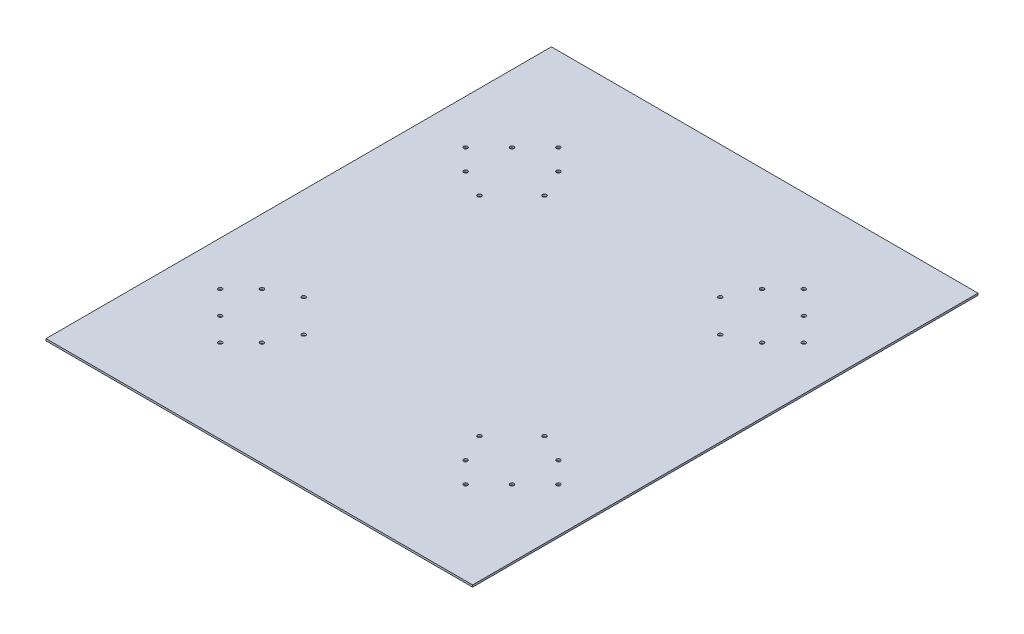
ISO-10303-21;
HEADER;
FILE_DESCRIPTION(('STEP AP214'),'2;1');
FILE_NAME('part.step','',(''),(''),'','','');
FILE_SCHEMA(('AUTOMOTIVE_DESIGN { 1 0 10303 214 1 1 1 1 }'));
ENDSEC;
DATA;
#1=APPLICATION_CONTEXT('core data for automotive mechanical design processes');
#2=APPLICATION_PROTOCOL_DEFINITION('international standard','automotive_design',2000,#1);
#3=PRODUCT_CONTEXT('',#1,'mechanical');
#4=PRODUCT('Part','Part','',(#3));
#5=PRODUCT_RELATED_PRODUCT_CATEGORY('part','',(#4));
#6=PRODUCT_DEFINITION_FORMATION('','',#4);
#7=PRODUCT_DEFINITION_CONTEXT('part definition',#1,'design');
#8=PRODUCT_DEFINITION('design','',#6,#7);
#9=PRODUCT_DEFINITION_SHAPE('','',#8);
#10=(LENGTH_UNIT() NAMED_UNIT(*) SI_UNIT(.MILLI.,.METRE.));
#11=(NAMED_UNIT(*) PLANE_ANGLE_UNIT() SI_UNIT($,.RADIAN.));
#12=(NAMED_UNIT(*) SI_UNIT($,.STERADIAN.) SOLID_ANGLE_UNIT());
#13=UNCERTAINTY_MEASURE_WITH_UNIT(LENGTH_MEASURE(1.E-05),#10,'distance_accuracy_value','');
#14=(GEOMETRIC_REPRESENTATION_CONTEXT(3) GLOBAL_UNCERTAINTY_ASSIGNED_CONTEXT((#13)) GLOBAL_UNIT_ASSIGNED_CONTEXT((#10,
#11,#12)) REPRESENTATION_CONTEXT('',''));
#15=CARTESIAN_POINT('',(0.,0.,0.));
#16=DIRECTION('',(0.,0.,1.));
#17=DIRECTION('',(1.,0.,0.));
#18=AXIS2_PLACEMENT_3D('',#15,#16,#17);
#19=CARTESIAN_POINT('',(3.7195855089245E-13,1313.54841330862,1889.22722695485));
#20=DIRECTION('',(0.,0.,-1.));
#21=DIRECTION('',(0.,1.,0.));
#22=AXIS2_PLACEMENT_3D('',#19,#20,#21);
#23=PLANE('',#22);
#24=DIRECTION('',(1.,0.,0.));
#25=VECTOR('',#24,1.);
#26=CARTESIAN_POINT('',(3.71209150350828E-13,1310.54841330862,1889.22722695485));
#27=LINE('',#26,#25);
#28=CARTESIAN_POINT('',(740.777273447474,1310.54841330862,1889.22722695485));
#29=VERTEX_POINT('',#28);
#30=CARTESIAN_POINT('',(1390.77727344747,1310.54841330862,1889.22722695485));
#31=VERTEX_POINT('',#30);
#32=EDGE_CURVE('E186',#29,#31,#27,.T.);
#33=ORIENTED_EDGE('',*,*,#32,.T.);
#34=DIRECTION('',(0.,-1.,0.));
#35=VECTOR('',#34,1.);
#36=CARTESIAN_POINT('',(1390.77727344747,1313.54841330862,1889.22722695485));
#37=LINE('',#36,#35);
#38=CARTESIAN_POINT('',(1390.77727344747,1313.54841330862,1889.22722695485));
#39=VERTEX_POINT('',#38);
#40=EDGE_CURVE('E11',#39,#31,#37,.T.);
#41=ORIENTED_EDGE('',*,*,#40,.F.);
#42=DIRECTION('',(1.,0.,0.));
#43=VECTOR('',#42,1.);
#44=CARTESIAN_POINT('',(3.7195855089245E-13,1313.54841330862,1889.22722695485));
#45=LINE('',#44,#43);
#46=CARTESIAN_POINT('',(740.777273447474,1313.54841330862,1889.22722695485));
#47=VERTEX_POINT('',#46);
#48=EDGE_CURVE('E88',#47,#39,#45,.T.);
#49=ORIENTED_EDGE('',*,*,#48,.F.);
#50=DIRECTION('',(0.,-1.,0.));
#51=VECTOR('',#50,1.);
#52=CARTESIAN_POINT('',(740.777273447474,1313.54841330862,1889.22722695485));
#53=LINE('',#52,#51);
#54=EDGE_CURVE('E54',#47,#29,#53,.T.);
#55=ORIENTED_EDGE('',*,*,#54,.T.);
#56=EDGE_LOOP('',(#33,#41,#49,#55));
#57=FACE_BOUND('',#56,.T.);
#58=ADVANCED_FACE('F37',(#57),#23,.F.);
#59=CARTESIAN_POINT('',(1390.77727344747,1313.54841330862,0.));
#60=DIRECTION('',(-1.,0.,0.));
#61=DIRECTION('',(0.,-1.,0.));
#62=AXIS2_PLACEMENT_3D('',#59,#60,#61);
#63=PLANE('',#62);
#64=DIRECTION('',(0.,0.,-1.));
#65=VECTOR('',#64,1.);
#66=CARTESIAN_POINT('',(1390.77727344747,1310.54841330862,0.));
#67=LINE('',#66,#65);
#68=CARTESIAN_POINT('',(1390.77727344747,1310.54841330862,1119.22722695485));
#69=VERTEX_POINT('',#68);
#70=EDGE_CURVE('E93',#31,#69,#67,.T.);
#71=ORIENTED_EDGE('',*,*,#70,.T.);
#72=DIRECTION('',(0.,-1.,0.));
#73=VECTOR('',#72,1.);
#74=CARTESIAN_POINT('',(1390.77727344747,1313.54841330862,1119.22722695485));
#75=LINE('',#74,#73);
#76=CARTESIAN_POINT('',(1390.77727344747,1313.54841330862,1119.22722695485));
#77=VERTEX_POINT('',#76);
#78=EDGE_CURVE('E46',#77,#69,#75,.T.);
#79=ORIENTED_EDGE('',*,*,#78,.F.);
#80=DIRECTION('',(0.,0.,-1.));
#81=VECTOR('',#80,1.);
#82=CARTESIAN_POINT('',(1390.77727344747,1313.54841330862,0.));
#83=LINE('',#82,#81);
#84=EDGE_CURVE('E79',#39,#77,#83,.T.);
#85=ORIENTED_EDGE('',*,*,#84,.F.);
#86=ORIENTED_EDGE('',*,*,#40,.T.);
#87=EDGE_LOOP('',(#71,#79,#85,#86));
#88=FACE_BOUND('',#87,.T.);
#89=ADVANCED_FACE('F92',(#88),#63,.F.);
#90=CARTESIAN_POINT('',(3.7195855089245E-13,1313.54841330862,1119.22722695485));
#91=DIRECTION('',(0.,0.,-1.));
#92=DIRECTION('',(0.,1.,0.));
#93=AXIS2_PLACEMENT_3D('',#90,#91,#92);
#94=PLANE('',#93);
#95=DIRECTION('',(1.,0.,0.));
#96=VECTOR('',#95,1.);
#97=CARTESIAN_POINT('',(3.71209150350828E-13,1310.54841330862,1119.22722695485));
#98=LINE('',#97,#96);
#99=CARTESIAN_POINT('',(740.777273447474,1310.54841330862,1119.22722695485));
#100=VERTEX_POINT('',#99);
#101=EDGE_CURVE('E189',#100,#69,#98,.T.);
#102=ORIENTED_EDGE('',*,*,#101,.F.);
#103=DIRECTION('',(0.,-1.,0.));
#104=VECTOR('',#103,1.);
#105=CARTESIAN_POINT('',(740.777273447474,1313.54841330862,1119.22722695485));
#106=LINE('',#105,#104);
#107=CARTESIAN_POINT('',(740.777273447474,1313.54841330862,1119.22722695485));
#108=VERTEX_POINT('',#107);
#109=EDGE_CURVE('E68',#108,#100,#106,.T.);
#110=ORIENTED_EDGE('',*,*,#109,.F.);
#111=DIRECTION('',(1.,0.,0.));
#112=VECTOR('',#111,1.);
#113=CARTESIAN_POINT('',(3.7195855089245E-13,1313.54841330862,1119.22722695485));
#114=LINE('',#113,#112);
#115=EDGE_CURVE('E87',#108,#77,#114,.T.);
#116=ORIENTED_EDGE('',*,*,#115,.T.);
#117=ORIENTED_EDGE('',*,*,#78,.T.);
#118=EDGE_LOOP('',(#102,#110,#116,#117));
#119=FACE_BOUND('',#118,.T.);
#120=ADVANCED_FACE('F96',(#119),#94,.T.);
#121=CARTESIAN_POINT('',(931.851249090738,1313.54841330862,1320.80372791505));
#122=DIRECTION('',(0.,-1.,0.));
#123=DIRECTION('',(1.,0.,0.));
#124=AXIS2_PLACEMENT_3D('',#121,#122,#123);
#125=CYLINDRICAL_SURFACE('',#124,3.00000000000015);
#126=CARTESIAN_POINT('',(931.851249090738,1313.54841330862,1320.80372791505));
#127=DIRECTION('',(0.,1.,0.));
#128=DIRECTION('',(-1.,0.,0.));
#129=AXIS2_PLACEMENT_3D('',#126,#127,#128);
#130=CIRCLE('',#129,3.00000000000015);
#131=CARTESIAN_POINT('',(928.851249090738,1313.54841330862,1320.80372791505));
#132=VERTEX_POINT('',#131);
#133=EDGE_CURVE('E174',#132,#132,#130,.T.);
#134=ORIENTED_EDGE('',*,*,#133,.T.);
#135=EDGE_LOOP('',(#134));
#136=FACE_BOUND('',#135,.T.);
#137=CARTESIAN_POINT('',(931.851249090738,1310.54841330862,1320.80372791505));
#138=DIRECTION('',(0.,1.,0.));
#139=DIRECTION('',(-1.,0.,0.));
#140=AXIS2_PLACEMENT_3D('',#137,#138,#139);
#141=CIRCLE('',#140,3.00000000000015);
#142=CARTESIAN_POINT('',(928.851249090738,1310.54841330862,1320.80372791505));
#143=VERTEX_POINT('',#142);
#144=EDGE_CURVE('E266',#143,#143,#141,.T.);
#145=ORIENTED_EDGE('',*,*,#144,.F.);
#146=EDGE_LOOP('',(#145));
#147=FACE_BOUND('',#146,.T.);
#148=ADVANCED_FACE('F324',(#136,#147),#125,.F.);
#149=CARTESIAN_POINT('',(910.638045655138,1313.54841330862,1278.37732104386));
#150=DIRECTION('',(0.,-1.,0.));
#151=DIRECTION('',(1.,0.,0.));
#152=AXIS2_PLACEMENT_3D('',#149,#150,#151);
#153=CYLINDRICAL_SURFACE('',#152,3.00000000000015);
#154=CARTESIAN_POINT('',(910.638045655138,1313.54841330862,1278.37732104386));
#155=DIRECTION('',(0.,1.,0.));
#156=DIRECTION('',(-1.,0.,0.));
#157=AXIS2_PLACEMENT_3D('',#154,#155,#156);
#158=CIRCLE('',#157,3.00000000000015);
#159=CARTESIAN_POINT('',(907.638045655138,1313.54841330862,1278.37732104386));
#160=VERTEX_POINT('',#159);
#161=EDGE_CURVE('E171',#160,#160,#158,.T.);
#162=ORIENTED_EDGE('',*,*,#161,.T.);
#163=EDGE_LOOP('',(#162));
#164=FACE_BOUND('',#163,.T.);
#165=CARTESIAN_POINT('',(910.638045655138,1310.54841330862,1278.37732104386));
#166=DIRECTION('',(0.,1.,0.));
#167=DIRECTION('',(-1.,0.,0.));
#168=AXIS2_PLACEMENT_3D('',#165,#166,#167);
#169=CIRCLE('',#168,3.00000000000015);
#170=CARTESIAN_POINT('',(907.638045655138,1310.54841330862,1278.37732104386));
#171=VERTEX_POINT('',#170);
#172=EDGE_CURVE('E263',#171,#171,#169,.T.);
#173=ORIENTED_EDGE('',*,*,#172,.F.);
#174=EDGE_LOOP('',(#173));
#175=FACE_BOUND('',#174,.T.);
#176=ADVANCED_FACE('F328',(#164,#175),#153,.F.);
#177=CARTESIAN_POINT('',(878.818240501748,1313.54841330862,1246.55751589047));
#178=DIRECTION('',(0.,-1.,0.));
#179=DIRECTION('',(1.,0.,0.));
#180=AXIS2_PLACEMENT_3D('',#177,#178,#179);
#181=CYLINDRICAL_SURFACE('',#180,3.00000000000015);
#182=CARTESIAN_POINT('',(878.818240501748,1313.54841330862,1246.55751589047));
#183=DIRECTION('',(0.,1.,0.));
#184=DIRECTION('',(-1.,0.,0.));
#185=AXIS2_PLACEMENT_3D('',#182,#183,#184);
#186=CIRCLE('',#185,3.00000000000015);
#187=CARTESIAN_POINT('',(875.818240501748,1313.54841330862,1246.55751589047));
#188=VERTEX_POINT('',#187);
#189=EDGE_CURVE('E168',#188,#188,#186,.T.);
#190=ORIENTED_EDGE('',*,*,#189,.T.);
#191=EDGE_LOOP('',(#190));
#192=FACE_BOUND('',#191,.T.);
#193=CARTESIAN_POINT('',(878.818240501748,1310.54841330862,1246.55751589047));
#194=DIRECTION('',(0.,1.,0.));
#195=DIRECTION('',(-1.,0.,0.));
#196=AXIS2_PLACEMENT_3D('',#193,#194,#195);
#197=CIRCLE('',#196,3.00000000000015);
#198=CARTESIAN_POINT('',(875.818240501748,1310.54841330862,1246.55751589047));
#199=VERTEX_POINT('',#198);
#200=EDGE_CURVE('E260',#199,#199,#197,.T.);
#201=ORIENTED_EDGE('',*,*,#200,.F.);
#202=EDGE_LOOP('',(#201));
#203=FACE_BOUND('',#202,.T.);
#204=ADVANCED_FACE('F334',(#192,#203),#181,.F.);
#205=CARTESIAN_POINT('',(843.462901442418,1313.54841330862,1281.9128549498));
#206=DIRECTION('',(0.,-1.,0.));
#207=DIRECTION('',(1.,0.,0.));
#208=AXIS2_PLACEMENT_3D('',#205,#206,#207);
#209=CYLINDRICAL_SURFACE('',#208,3.00000000000015);
#210=CARTESIAN_POINT('',(843.462901442418,1313.54841330862,1281.9128549498));
#211=DIRECTION('',(0.,1.,0.));
#212=DIRECTION('',(-1.,0.,0.));
#213=AXIS2_PLACEMENT_3D('',#210,#211,#212);
#214=CIRCLE('',#213,3.00000000000015);
#215=CARTESIAN_POINT('',(840.462901442418,1313.54841330862,1281.9128549498));
#216=VERTEX_POINT('',#215);
#217=EDGE_CURVE('E165',#216,#216,#214,.T.);
#218=ORIENTED_EDGE('',*,*,#217,.T.);
#219=EDGE_LOOP('',(#218));
#220=FACE_BOUND('',#219,.T.);
#221=CARTESIAN_POINT('',(843.462901442418,1310.54841330862,1281.9128549498));
#222=DIRECTION('',(0.,1.,0.));
#223=DIRECTION('',(-1.,0.,0.));
#224=AXIS2_PLACEMENT_3D('',#221,#222,#223);
#225=CIRCLE('',#224,3.00000000000015);
#226=CARTESIAN_POINT('',(840.462901442418,1310.54841330862,1281.9128549498));
#227=VERTEX_POINT('',#226);
#228=EDGE_CURVE('E257',#227,#227,#225,.T.);
#229=ORIENTED_EDGE('',*,*,#228,.F.);
#230=EDGE_LOOP('',(#229));
#231=FACE_BOUND('',#230,.T.);
#232=ADVANCED_FACE('F341',(#220,#231),#209,.F.);
#233=CARTESIAN_POINT('',(808.107562383088,1313.54841330862,1317.26819400912));
#234=DIRECTION('',(0.,-1.,0.));
#235=DIRECTION('',(1.,0.,0.));
#236=AXIS2_PLACEMENT_3D('',#233,#234,#235);
#237=CYLINDRICAL_SURFACE('',#236,3.00000000000015);
#238=CARTESIAN_POINT('',(808.107562383088,1313.54841330862,1317.26819400912));
#239=DIRECTION('',(0.,1.,0.));
#240=DIRECTION('',(-1.,0.,0.));
#241=AXIS2_PLACEMENT_3D('',#238,#239,#240);
#242=CIRCLE('',#241,3.00000000000015);
#243=CARTESIAN_POINT('',(805.107562383088,1313.54841330862,1317.26819400912));
#244=VERTEX_POINT('',#243);
#245=EDGE_CURVE('E162',#244,#244,#242,.T.);
#246=ORIENTED_EDGE('',*,*,#245,.T.);
#247=EDGE_LOOP('',(#246));
#248=FACE_BOUND('',#247,.T.);
#249=CARTESIAN_POINT('',(808.107562383088,1310.54841330862,1317.26819400912));
#250=DIRECTION('',(0.,1.,0.));
#251=DIRECTION('',(-1.,0.,0.));
#252=AXIS2_PLACEMENT_3D('',#249,#250,#251);
#253=CIRCLE('',#252,3.00000000000015);
#254=CARTESIAN_POINT('',(805.107562383088,1310.54841330862,1317.26819400912));
#255=VERTEX_POINT('',#254);
#256=EDGE_CURVE('E254',#255,#255,#253,.T.);
#257=ORIENTED_EDGE('',*,*,#256,.F.);
#258=EDGE_LOOP('',(#257));
#259=FACE_BOUND('',#258,.T.);
#260=ADVANCED_FACE('F345',(#248,#259),#237,.F.);
#261=CARTESIAN_POINT('',(839.927367536488,1313.54841330862,1349.08799916252));
#262=DIRECTION('',(0.,-1.,0.));
#263=DIRECTION('',(1.,0.,0.));
#264=AXIS2_PLACEMENT_3D('',#261,#262,#263);
#265=CYLINDRICAL_SURFACE('',#264,3.00000000000015);
#266=CARTESIAN_POINT('',(839.927367536488,1313.54841330862,1349.08799916252));
#267=DIRECTION('',(0.,1.,0.));
#268=DIRECTION('',(-1.,0.,0.));
#269=AXIS2_PLACEMENT_3D('',#266,#267,#268);
#270=CIRCLE('',#269,3.00000000000015);
#271=CARTESIAN_POINT('',(836.927367536488,1313.54841330862,1349.08799916252));
#272=VERTEX_POINT('',#271);
#273=EDGE_CURVE('E159',#272,#272,#270,.T.);
#274=ORIENTED_EDGE('',*,*,#273,.T.);
#275=EDGE_LOOP('',(#274));
#276=FACE_BOUND('',#275,.T.);
#277=CARTESIAN_POINT('',(839.927367536488,1310.54841330862,1349.08799916252));
#278=DIRECTION('',(0.,1.,0.));
#279=DIRECTION('',(-1.,0.,0.));
#280=AXIS2_PLACEMENT_3D('',#277,#278,#279);
#281=CIRCLE('',#280,3.00000000000015);
#282=CARTESIAN_POINT('',(836.927367536488,1310.54841330862,1349.08799916252));
#283=VERTEX_POINT('',#282);
#284=EDGE_CURVE('E251',#283,#283,#281,.T.);
#285=ORIENTED_EDGE('',*,*,#284,.F.);
#286=EDGE_LOOP('',(#285));
#287=FACE_BOUND('',#286,.T.);
#288=ADVANCED_FACE('F349',(#276,#287),#265,.F.);
#289=CARTESIAN_POINT('',(1249.20077248726,1313.54841330862,1638.15325131158));
#290=DIRECTION('',(0.,-1.,0.));
#291=DIRECTION('',(1.,0.,0.));
#292=AXIS2_PLACEMENT_3D('',#289,#290,#291);
#293=CYLINDRICAL_SURFACE('',#292,3.00000000000015);
#294=CARTESIAN_POINT('',(1249.20077248726,1313.54841330862,1638.15325131158));
#295=DIRECTION('',(0.,1.,0.));
#296=DIRECTION('',(-1.,0.,0.));
#297=AXIS2_PLACEMENT_3D('',#294,#295,#296);
#298=CIRCLE('',#297,3.00000000000015);
#299=CARTESIAN_POINT('',(1246.20077248726,1313.54841330862,1638.15325131158));
#300=VERTEX_POINT('',#299);
#301=EDGE_CURVE('E156',#300,#300,#298,.T.);
#302=ORIENTED_EDGE('',*,*,#301,.T.);
#303=EDGE_LOOP('',(#302));
#304=FACE_BOUND('',#303,.T.);
#305=CARTESIAN_POINT('',(1249.20077248726,1310.54841330862,1638.15325131158));
#306=DIRECTION('',(0.,1.,0.));
#307=DIRECTION('',(-1.,0.,0.));
#308=AXIS2_PLACEMENT_3D('',#305,#306,#307);
#309=CIRCLE('',#308,3.00000000000015);
#310=CARTESIAN_POINT('',(1246.20077248726,1310.54841330862,1638.15325131158));
#311=VERTEX_POINT('',#310);
#312=EDGE_CURVE('E248',#311,#311,#309,.T.);
#313=ORIENTED_EDGE('',*,*,#312,.F.);
#314=EDGE_LOOP('',(#313));
#315=FACE_BOUND('',#314,.T.);
#316=ADVANCED_FACE('F353',(#304,#315),#293,.F.);
#317=CARTESIAN_POINT('',(1199.7032978042,1313.54841330862,1687.65072599464));
#318=DIRECTION('',(0.,-1.,0.));
#319=DIRECTION('',(1.,0.,0.));
#320=AXIS2_PLACEMENT_3D('',#317,#318,#319);
#321=CYLINDRICAL_SURFACE('',#320,3.00000000000015);
#322=CARTESIAN_POINT('',(1199.7032978042,1313.54841330862,1687.65072599464));
#323=DIRECTION('',(0.,1.,0.));
#324=DIRECTION('',(-1.,0.,0.));
#325=AXIS2_PLACEMENT_3D('',#322,#323,#324);
#326=CIRCLE('',#325,3.00000000000015);
#327=CARTESIAN_POINT('',(1196.7032978042,1313.54841330862,1687.65072599464));
#328=VERTEX_POINT('',#327);
#329=EDGE_CURVE('E153',#328,#328,#326,.T.);
#330=ORIENTED_EDGE('',*,*,#329,.T.);
#331=EDGE_LOOP('',(#330));
#332=FACE_BOUND('',#331,.T.);
#333=CARTESIAN_POINT('',(1199.7032978042,1310.54841330862,1687.65072599464));
#334=DIRECTION('',(0.,1.,0.));
#335=DIRECTION('',(-1.,0.,0.));
#336=AXIS2_PLACEMENT_3D('',#333,#334,#335);
#337=CIRCLE('',#336,3.00000000000015);
#338=CARTESIAN_POINT('',(1196.7032978042,1310.54841330862,1687.65072599464));
#339=VERTEX_POINT('',#338);
#340=EDGE_CURVE('E245',#339,#339,#337,.T.);
#341=ORIENTED_EDGE('',*,*,#340,.F.);
#342=EDGE_LOOP('',(#341));
#343=FACE_BOUND('',#342,.T.);
#344=ADVANCED_FACE('F357',(#332,#343),#321,.F.);
#345=CARTESIAN_POINT('',(1220.9165012398,1313.54841330862,1730.07713286583));
#346=DIRECTION('',(0.,-1.,0.));
#347=DIRECTION('',(1.,0.,0.));
#348=AXIS2_PLACEMENT_3D('',#345,#346,#347);
#349=CYLINDRICAL_SURFACE('',#348,3.00000000000015);
#350=CARTESIAN_POINT('',(1220.9165012398,1313.54841330862,1730.07713286583));
#351=DIRECTION('',(0.,1.,0.));
#352=DIRECTION('',(-1.,0.,0.));
#353=AXIS2_PLACEMENT_3D('',#350,#351,#352);
#354=CIRCLE('',#353,3.00000000000015);
#355=CARTESIAN_POINT('',(1217.9165012398,1313.54841330862,1730.07713286583));
#356=VERTEX_POINT('',#355);
#357=EDGE_CURVE('E150',#356,#356,#354,.T.);
#358=ORIENTED_EDGE('',*,*,#357,.T.);
#359=EDGE_LOOP('',(#358));
#360=FACE_BOUND('',#359,.T.);
#361=CARTESIAN_POINT('',(1220.9165012398,1310.54841330862,1730.07713286583));
#362=DIRECTION('',(0.,1.,0.));
#363=DIRECTION('',(-1.,0.,0.));
#364=AXIS2_PLACEMENT_3D('',#361,#362,#363);
#365=CIRCLE('',#364,3.00000000000015);
#366=CARTESIAN_POINT('',(1217.9165012398,1310.54841330862,1730.07713286583));
#367=VERTEX_POINT('',#366);
#368=EDGE_CURVE('E242',#367,#367,#365,.T.);
#369=ORIENTED_EDGE('',*,*,#368,.F.);
#370=EDGE_LOOP('',(#369));
#371=FACE_BOUND('',#370,.T.);
#372=ADVANCED_FACE('F361',(#360,#371),#349,.F.);
#373=CARTESIAN_POINT('',(1252.73630639319,1313.54841330862,1761.89693801923));
#374=DIRECTION('',(0.,-1.,0.));
#375=DIRECTION('',(1.,0.,0.));
#376=AXIS2_PLACEMENT_3D('',#373,#374,#375);
#377=CYLINDRICAL_SURFACE('',#376,3.00000000000015);
#378=CARTESIAN_POINT('',(1252.73630639319,1313.54841330862,1761.89693801923));
#379=DIRECTION('',(0.,1.,0.));
#380=DIRECTION('',(-1.,0.,0.));
#381=AXIS2_PLACEMENT_3D('',#378,#379,#380);
#382=CIRCLE('',#381,3.00000000000015);
#383=CARTESIAN_POINT('',(1249.73630639319,1313.54841330862,1761.89693801923));
#384=VERTEX_POINT('',#383);
#385=EDGE_CURVE('E147',#384,#384,#382,.T.);
#386=ORIENTED_EDGE('',*,*,#385,.T.);
#387=EDGE_LOOP('',(#386));
#388=FACE_BOUND('',#387,.T.);
#389=CARTESIAN_POINT('',(1252.73630639319,1310.54841330862,1761.89693801923));
#390=DIRECTION('',(0.,1.,0.));
#391=DIRECTION('',(-1.,0.,0.));
#392=AXIS2_PLACEMENT_3D('',#389,#390,#391);
#393=CIRCLE('',#392,3.00000000000015);
#394=CARTESIAN_POINT('',(1249.73630639319,1310.54841330862,1761.89693801923));
#395=VERTEX_POINT('',#394);
#396=EDGE_CURVE('E239',#395,#395,#393,.T.);
#397=ORIENTED_EDGE('',*,*,#396,.F.);
#398=EDGE_LOOP('',(#397));
#399=FACE_BOUND('',#398,.T.);
#400=ADVANCED_FACE('F365',(#388,#399),#377,.F.);
#401=CARTESIAN_POINT('',(1288.09164545252,1313.54841330862,1726.5415989599));
#402=DIRECTION('',(0.,-1.,0.));
#403=DIRECTION('',(1.,0.,0.));
#404=AXIS2_PLACEMENT_3D('',#401,#402,#403);
#405=CYLINDRICAL_SURFACE('',#404,3.00000000000015);
#406=CARTESIAN_POINT('',(1288.09164545252,1313.54841330862,1726.5415989599));
#407=DIRECTION('',(0.,1.,0.));
#408=DIRECTION('',(-1.,0.,0.));
#409=AXIS2_PLACEMENT_3D('',#406,#407,#408);
#410=CIRCLE('',#409,3.00000000000015);
#411=CARTESIAN_POINT('',(1285.09164545252,1313.54841330862,1726.5415989599));
#412=VERTEX_POINT('',#411);
#413=EDGE_CURVE('E144',#412,#412,#410,.T.);
#414=ORIENTED_EDGE('',*,*,#413,.T.);
#415=EDGE_LOOP('',(#414));
#416=FACE_BOUND('',#415,.T.);
#417=CARTESIAN_POINT('',(1288.09164545252,1310.54841330862,1726.5415989599));
#418=DIRECTION('',(0.,1.,0.));
#419=DIRECTION('',(-1.,0.,0.));
#420=AXIS2_PLACEMENT_3D('',#417,#418,#419);
#421=CIRCLE('',#420,3.00000000000015);
#422=CARTESIAN_POINT('',(1285.09164545252,1310.54841330862,1726.5415989599));
#423=VERTEX_POINT('',#422);
#424=EDGE_CURVE('E236',#423,#423,#421,.T.);
#425=ORIENTED_EDGE('',*,*,#424,.F.);
#426=EDGE_LOOP('',(#425));
#427=FACE_BOUND('',#426,.T.);
#428=ADVANCED_FACE('F369',(#416,#427),#405,.F.);
#429=CARTESIAN_POINT('',(1323.44698451185,1313.54841330862,1691.18625990057));
#430=DIRECTION('',(0.,-1.,0.));
#431=DIRECTION('',(1.,0.,0.));
#432=AXIS2_PLACEMENT_3D('',#429,#430,#431);
#433=CYLINDRICAL_SURFACE('',#432,3.00000000000015);
#434=CARTESIAN_POINT('',(1323.44698451185,1313.54841330862,1691.18625990057));
#435=DIRECTION('',(0.,1.,0.));
#436=DIRECTION('',(-1.,0.,0.));
#437=AXIS2_PLACEMENT_3D('',#434,#435,#436);
#438=CIRCLE('',#437,3.00000000000015);
#439=CARTESIAN_POINT('',(1320.44698451185,1313.54841330862,1691.18625990057));
#440=VERTEX_POINT('',#439);
#441=EDGE_CURVE('E141',#440,#440,#438,.T.);
#442=ORIENTED_EDGE('',*,*,#441,.T.);
#443=EDGE_LOOP('',(#442));
#444=FACE_BOUND('',#443,.T.);
#445=CARTESIAN_POINT('',(1323.44698451185,1310.54841330862,1691.18625990057));
#446=DIRECTION('',(0.,1.,0.));
#447=DIRECTION('',(-1.,0.,0.));
#448=AXIS2_PLACEMENT_3D('',#445,#446,#447);
#449=CIRCLE('',#448,3.00000000000015);
#450=CARTESIAN_POINT('',(1320.44698451185,1310.54841330862,1691.18625990057));
#451=VERTEX_POINT('',#450);
#452=EDGE_CURVE('E233',#451,#451,#449,.T.);
#453=ORIENTED_EDGE('',*,*,#452,.F.);
#454=EDGE_LOOP('',(#453));
#455=FACE_BOUND('',#454,.T.);
#456=ADVANCED_FACE('F373',(#444,#455),#433,.F.);
#457=CARTESIAN_POINT('',(1291.62717935845,1313.54841330862,1659.36645474718));
#458=DIRECTION('',(0.,-1.,0.));
#459=DIRECTION('',(1.,0.,0.));
#460=AXIS2_PLACEMENT_3D('',#457,#458,#459);
#461=CYLINDRICAL_SURFACE('',#460,3.00000000000015);
#462=CARTESIAN_POINT('',(1291.62717935845,1313.54841330862,1659.36645474718));
#463=DIRECTION('',(0.,1.,0.));
#464=DIRECTION('',(-1.,0.,0.));
#465=AXIS2_PLACEMENT_3D('',#462,#463,#464);
#466=CIRCLE('',#465,3.00000000000015);
#467=CARTESIAN_POINT('',(1288.62717935845,1313.54841330862,1659.36645474718));
#468=VERTEX_POINT('',#467);
#469=EDGE_CURVE('E138',#468,#468,#466,.T.);
#470=ORIENTED_EDGE('',*,*,#469,.T.);
#471=EDGE_LOOP('',(#470));
#472=FACE_BOUND('',#471,.T.);
#473=CARTESIAN_POINT('',(1291.62717935845,1310.54841330862,1659.36645474718));
#474=DIRECTION('',(0.,1.,0.));
#475=DIRECTION('',(-1.,0.,0.));
#476=AXIS2_PLACEMENT_3D('',#473,#474,#475);
#477=CIRCLE('',#476,3.00000000000015);
#478=CARTESIAN_POINT('',(1288.62717935845,1310.54841330862,1659.36645474718));
#479=VERTEX_POINT('',#478);
#480=EDGE_CURVE('E230',#479,#479,#477,.T.);
#481=ORIENTED_EDGE('',*,*,#480,.F.);
#482=EDGE_LOOP('',(#481));
#483=FACE_BOUND('',#482,.T.);
#484=ADVANCED_FACE('F377',(#472,#483),#461,.F.);
#485=CARTESIAN_POINT('',(839.927367536488,1313.54841330862,1659.36645474717));
#486=DIRECTION('',(0.,-1.,0.));
#487=DIRECTION('',(1.,0.,0.));
#488=AXIS2_PLACEMENT_3D('',#485,#486,#487);
#489=CYLINDRICAL_SURFACE('',#488,3.00000000000015);
#490=CARTESIAN_POINT('',(839.927367536488,1313.54841330862,1659.36645474717));
#491=DIRECTION('',(0.,1.,0.));
#492=DIRECTION('',(-1.,0.,0.));
#493=AXIS2_PLACEMENT_3D('',#490,#491,#492);
#494=CIRCLE('',#493,3.00000000000015);
#495=CARTESIAN_POINT('',(836.927367536488,1313.54841330862,1659.36645474717));
#496=VERTEX_POINT('',#495);
#497=EDGE_CURVE('E135',#496,#496,#494,.T.);
#498=ORIENTED_EDGE('',*,*,#497,.T.);
#499=EDGE_LOOP('',(#498));
#500=FACE_BOUND('',#499,.T.);
#501=CARTESIAN_POINT('',(839.927367536488,1310.54841330862,1659.36645474717));
#502=DIRECTION('',(0.,1.,0.));
#503=DIRECTION('',(-1.,0.,0.));
#504=AXIS2_PLACEMENT_3D('',#501,#502,#503);
#505=CIRCLE('',#504,3.00000000000015);
#506=CARTESIAN_POINT('',(836.927367536488,1310.54841330862,1659.36645474717));
#507=VERTEX_POINT('',#506);
#508=EDGE_CURVE('E227',#507,#507,#505,.T.);
#509=ORIENTED_EDGE('',*,*,#508,.F.);
#510=EDGE_LOOP('',(#509));
#511=FACE_BOUND('',#510,.T.);
#512=ADVANCED_FACE('F381',(#500,#511),#489,.F.);
#513=CARTESIAN_POINT('',(808.107562383088,1313.54841330862,1691.18625990057));
#514=DIRECTION('',(0.,-1.,0.));
#515=DIRECTION('',(1.,0.,0.));
#516=AXIS2_PLACEMENT_3D('',#513,#514,#515);
#517=CYLINDRICAL_SURFACE('',#516,3.00000000000015);
#518=CARTESIAN_POINT('',(808.107562383088,1313.54841330862,1691.18625990057));
#519=DIRECTION('',(0.,1.,0.));
#520=DIRECTION('',(-1.,0.,0.));
#521=AXIS2_PLACEMENT_3D('',#518,#519,#520);
#522=CIRCLE('',#521,3.00000000000015);
#523=CARTESIAN_POINT('',(805.107562383088,1313.54841330862,1691.18625990057));
#524=VERTEX_POINT('',#523);
#525=EDGE_CURVE('E132',#524,#524,#522,.T.);
#526=ORIENTED_EDGE('',*,*,#525,.T.);
#527=EDGE_LOOP('',(#526));
#528=FACE_BOUND('',#527,.T.);
#529=CARTESIAN_POINT('',(808.107562383088,1310.54841330862,1691.18625990057));
#530=DIRECTION('',(0.,1.,0.));
#531=DIRECTION('',(-1.,0.,0.));
#532=AXIS2_PLACEMENT_3D('',#529,#530,#531);
#533=CIRCLE('',#532,3.00000000000015);
#534=CARTESIAN_POINT('',(805.107562383088,1310.54841330862,1691.18625990057));
#535=VERTEX_POINT('',#534);
#536=EDGE_CURVE('E224',#535,#535,#533,.T.);
#537=ORIENTED_EDGE('',*,*,#536,.F.);
#538=EDGE_LOOP('',(#537));
#539=FACE_BOUND('',#538,.T.);
#540=ADVANCED_FACE('F385',(#528,#539),#517,.F.);
#541=CARTESIAN_POINT('',(882.353774407678,1313.54841330862,1638.15325131158));
#542=DIRECTION('',(0.,-1.,0.));
#543=DIRECTION('',(1.,0.,0.));
#544=AXIS2_PLACEMENT_3D('',#541,#542,#543);
#545=CYLINDRICAL_SURFACE('',#544,3.00000000000015);
#546=CARTESIAN_POINT('',(882.353774407678,1313.54841330862,1638.15325131158));
#547=DIRECTION('',(0.,1.,0.));
#548=DIRECTION('',(-1.,0.,0.));
#549=AXIS2_PLACEMENT_3D('',#546,#547,#548);
#550=CIRCLE('',#549,3.00000000000015);
#551=CARTESIAN_POINT('',(879.353774407678,1313.54841330862,1638.15325131158));
#552=VERTEX_POINT('',#551);
#553=EDGE_CURVE('E129',#552,#552,#550,.T.);
#554=ORIENTED_EDGE('',*,*,#553,.T.);
#555=EDGE_LOOP('',(#554));
#556=FACE_BOUND('',#555,.T.);
#557=CARTESIAN_POINT('',(882.353774407678,1310.54841330862,1638.15325131158));
#558=DIRECTION('',(0.,1.,0.));
#559=DIRECTION('',(-1.,0.,0.));
#560=AXIS2_PLACEMENT_3D('',#557,#558,#559);
#561=CIRCLE('',#560,3.00000000000015);
#562=CARTESIAN_POINT('',(879.353774407678,1310.54841330862,1638.15325131158));
#563=VERTEX_POINT('',#562);
#564=EDGE_CURVE('E221',#563,#563,#561,.T.);
#565=ORIENTED_EDGE('',*,*,#564,.F.);
#566=EDGE_LOOP('',(#565));
#567=FACE_BOUND('',#566,.T.);
#568=ADVANCED_FACE('F389',(#556,#567),#545,.F.);
#569=CARTESIAN_POINT('',(1252.73630639319,1313.54841330862,1246.55751589047));
#570=DIRECTION('',(0.,-1.,0.));
#571=DIRECTION('',(1.,0.,0.));
#572=AXIS2_PLACEMENT_3D('',#569,#570,#571);
#573=CYLINDRICAL_SURFACE('',#572,3.00000000000011);
#574=CARTESIAN_POINT('',(1252.73630639319,1313.54841330862,1246.55751589047));
#575=DIRECTION('',(0.,1.,0.));
#576=DIRECTION('',(-1.,0.,0.));
#577=AXIS2_PLACEMENT_3D('',#574,#575,#576);
#578=CIRCLE('',#577,3.00000000000011);
#579=CARTESIAN_POINT('',(1249.73630639319,1313.54841330862,1246.55751589047));
#580=VERTEX_POINT('',#579);
#581=EDGE_CURVE('E126',#580,#580,#578,.F.);
#582=ORIENTED_EDGE('',*,*,#581,.F.);
#583=EDGE_LOOP('',(#582));
#584=FACE_BOUND('',#583,.T.);
#585=CARTESIAN_POINT('',(1252.73630639319,1310.54841330862,1246.55751589047));
#586=DIRECTION('',(0.,1.,0.));
#587=DIRECTION('',(-1.,0.,0.));
#588=AXIS2_PLACEMENT_3D('',#585,#586,#587);
#589=CIRCLE('',#588,3.00000000000011);
#590=CARTESIAN_POINT('',(1249.73630639319,1310.54841330862,1246.55751589047));
#591=VERTEX_POINT('',#590);
#592=EDGE_CURVE('E218',#591,#591,#589,.F.);
#593=ORIENTED_EDGE('',*,*,#592,.T.);
#594=EDGE_LOOP('',(#593));
#595=FACE_BOUND('',#594,.T.);
#596=ADVANCED_FACE('F393',(#584,#595),#573,.F.);
#597=CARTESIAN_POINT('',(1199.7032978042,1313.54841330862,1320.80372791506));
#598=DIRECTION('',(0.,-1.,0.));
#599=DIRECTION('',(1.,0.,0.));
#600=AXIS2_PLACEMENT_3D('',#597,#598,#599);
#601=CYLINDRICAL_SURFACE('',#600,3.00000000000012);
#602=CARTESIAN_POINT('',(1199.7032978042,1313.54841330862,1320.80372791506));
#603=DIRECTION('',(0.,1.,0.));
#604=DIRECTION('',(-1.,0.,0.));
#605=AXIS2_PLACEMENT_3D('',#602,#603,#604);
#606=CIRCLE('',#605,3.00000000000012);
#607=CARTESIAN_POINT('',(1196.7032978042,1313.54841330862,1320.80372791506));
#608=VERTEX_POINT('',#607);
#609=EDGE_CURVE('E123',#608,#608,#606,.F.);
#610=ORIENTED_EDGE('',*,*,#609,.F.);
#611=EDGE_LOOP('',(#610));
#612=FACE_BOUND('',#611,.T.);
#613=CARTESIAN_POINT('',(1199.7032978042,1310.54841330862,1320.80372791506));
#614=DIRECTION('',(0.,1.,0.));
#615=DIRECTION('',(-1.,0.,0.));
#616=AXIS2_PLACEMENT_3D('',#613,#614,#615);
#617=CIRCLE('',#616,3.00000000000012);
#618=CARTESIAN_POINT('',(1196.7032978042,1310.54841330862,1320.80372791506));
#619=VERTEX_POINT('',#618);
#620=EDGE_CURVE('E215',#619,#619,#617,.F.);
#621=ORIENTED_EDGE('',*,*,#620,.T.);
#622=EDGE_LOOP('',(#621));
#623=FACE_BOUND('',#622,.T.);
#624=ADVANCED_FACE('F397',(#612,#623),#601,.F.);
#625=CARTESIAN_POINT('',(1220.9165012398,1313.54841330862,1278.37732104386));
#626=DIRECTION('',(0.,-1.,0.));
#627=DIRECTION('',(1.,0.,0.));
#628=AXIS2_PLACEMENT_3D('',#625,#626,#627);
#629=CYLINDRICAL_SURFACE('',#628,3.00000000000026);
#630=CARTESIAN_POINT('',(1220.9165012398,1313.54841330862,1278.37732104386));
#631=DIRECTION('',(0.,1.,0.));
#632=DIRECTION('',(-1.,0.,0.));
#633=AXIS2_PLACEMENT_3D('',#630,#631,#632);
#634=CIRCLE('',#633,3.00000000000026);
#635=CARTESIAN_POINT('',(1217.9165012398,1313.54841330862,1278.37732104386));
#636=VERTEX_POINT('',#635);
#637=EDGE_CURVE('E120',#636,#636,#634,.F.);
#638=ORIENTED_EDGE('',*,*,#637,.F.);
#639=EDGE_LOOP('',(#638));
#640=FACE_BOUND('',#639,.T.);
#641=CARTESIAN_POINT('',(1220.9165012398,1310.54841330862,1278.37732104386));
#642=DIRECTION('',(0.,1.,0.));
#643=DIRECTION('',(-1.,0.,0.));
#644=AXIS2_PLACEMENT_3D('',#641,#642,#643);
#645=CIRCLE('',#644,3.00000000000026);
#646=CARTESIAN_POINT('',(1217.9165012398,1310.54841330862,1278.37732104386));
#647=VERTEX_POINT('',#646);
#648=EDGE_CURVE('E212',#647,#647,#645,.F.);
#649=ORIENTED_EDGE('',*,*,#648,.T.);
#650=EDGE_LOOP('',(#649));
#651=FACE_BOUND('',#650,.T.);
#652=ADVANCED_FACE('F401',(#640,#651),#629,.F.);
#653=CARTESIAN_POINT('',(1291.62717935845,1313.54841330862,1349.08799916252));
#654=DIRECTION('',(0.,-1.,0.));
#655=DIRECTION('',(1.,0.,0.));
#656=AXIS2_PLACEMENT_3D('',#653,#654,#655);
#657=CYLINDRICAL_SURFACE('',#656,3.00000000000011);
#658=CARTESIAN_POINT('',(1291.62717935845,1313.54841330862,1349.08799916252));
#659=DIRECTION('',(0.,1.,0.));
#660=DIRECTION('',(-1.,0.,0.));
#661=AXIS2_PLACEMENT_3D('',#658,#659,#660);
#662=CIRCLE('',#661,3.00000000000011);
#663=CARTESIAN_POINT('',(1288.62717935845,1313.54841330862,1349.08799916252));
#664=VERTEX_POINT('',#663);
#665=EDGE_CURVE('E117',#664,#664,#662,.F.);
#666=ORIENTED_EDGE('',*,*,#665,.F.);
#667=EDGE_LOOP('',(#666));
#668=FACE_BOUND('',#667,.T.);
#669=CARTESIAN_POINT('',(1291.62717935845,1310.54841330862,1349.08799916252));
#670=DIRECTION('',(0.,1.,0.));
#671=DIRECTION('',(-1.,0.,0.));
#672=AXIS2_PLACEMENT_3D('',#669,#670,#671);
#673=CIRCLE('',#672,3.00000000000011);
#674=CARTESIAN_POINT('',(1288.62717935845,1310.54841330862,1349.08799916252));
#675=VERTEX_POINT('',#674);
#676=EDGE_CURVE('E209',#675,#675,#673,.F.);
#677=ORIENTED_EDGE('',*,*,#676,.T.);
#678=EDGE_LOOP('',(#677));
#679=FACE_BOUND('',#678,.T.);
#680=ADVANCED_FACE('F405',(#668,#679),#657,.F.);
#681=CARTESIAN_POINT('',(1249.20077248726,1313.54841330862,1370.30120259811));
#682=DIRECTION('',(0.,-1.,0.));
#683=DIRECTION('',(1.,0.,0.));
#684=AXIS2_PLACEMENT_3D('',#681,#682,#683);
#685=CYLINDRICAL_SURFACE('',#684,3.00000000000027);
#686=CARTESIAN_POINT('',(1249.20077248726,1313.54841330862,1370.30120259811));
#687=DIRECTION('',(0.,1.,0.));
#688=DIRECTION('',(-1.,0.,0.));
#689=AXIS2_PLACEMENT_3D('',#686,#687,#688);
#690=CIRCLE('',#689,3.00000000000027);
#691=CARTESIAN_POINT('',(1246.20077248726,1313.54841330862,1370.30120259811));
#692=VERTEX_POINT('',#691);
#693=EDGE_CURVE('E114',#692,#692,#690,.F.);
#694=ORIENTED_EDGE('',*,*,#693,.F.);
#695=EDGE_LOOP('',(#694));
#696=FACE_BOUND('',#695,.T.);
#697=CARTESIAN_POINT('',(1249.20077248726,1310.54841330862,1370.30120259811));
#698=DIRECTION('',(0.,1.,0.));
#699=DIRECTION('',(-1.,0.,0.));
#700=AXIS2_PLACEMENT_3D('',#697,#698,#699);
#701=CIRCLE('',#700,3.00000000000027);
#702=CARTESIAN_POINT('',(1246.20077248726,1310.54841330862,1370.30120259811));
#703=VERTEX_POINT('',#702);
#704=EDGE_CURVE('E206',#703,#703,#701,.F.);
#705=ORIENTED_EDGE('',*,*,#704,.T.);
#706=EDGE_LOOP('',(#705));
#707=FACE_BOUND('',#706,.T.);
#708=ADVANCED_FACE('F409',(#696,#707),#685,.F.);
#709=CARTESIAN_POINT('',(1323.44698451185,1313.54841330862,1317.26819400912));
#710=DIRECTION('',(0.,-1.,0.));
#711=DIRECTION('',(1.,0.,0.));
#712=AXIS2_PLACEMENT_3D('',#709,#710,#711);
#713=CYLINDRICAL_SURFACE('',#712,3.0000000000001);
#714=CARTESIAN_POINT('',(1323.44698451185,1313.54841330862,1317.26819400912));
#715=DIRECTION('',(0.,1.,0.));
#716=DIRECTION('',(-1.,0.,0.));
#717=AXIS2_PLACEMENT_3D('',#714,#715,#716);
#718=CIRCLE('',#717,3.0000000000001);
#719=CARTESIAN_POINT('',(1320.44698451185,1313.54841330862,1317.26819400912));
#720=VERTEX_POINT('',#719);
#721=EDGE_CURVE('E111',#720,#720,#718,.F.);
#722=ORIENTED_EDGE('',*,*,#721,.F.);
#723=EDGE_LOOP('',(#722));
#724=FACE_BOUND('',#723,.T.);
#725=CARTESIAN_POINT('',(1323.44698451185,1310.54841330862,1317.26819400912));
#726=DIRECTION('',(0.,1.,0.));
#727=DIRECTION('',(-1.,0.,0.));
#728=AXIS2_PLACEMENT_3D('',#725,#726,#727);
#729=CIRCLE('',#728,3.0000000000001);
#730=CARTESIAN_POINT('',(1320.44698451185,1310.54841330862,1317.26819400912));
#731=VERTEX_POINT('',#730);
#732=EDGE_CURVE('E203',#731,#731,#729,.F.);
#733=ORIENTED_EDGE('',*,*,#732,.T.);
#734=EDGE_LOOP('',(#733));
#735=FACE_BOUND('',#734,.T.);
#736=ADVANCED_FACE('F413',(#724,#735),#713,.F.);
#737=CARTESIAN_POINT('',(878.818240501748,1313.54841330862,1761.89693801922));
#738=DIRECTION('',(0.,-1.,0.));
#739=DIRECTION('',(1.,0.,0.));
#740=AXIS2_PLACEMENT_3D('',#737,#738,#739);
#741=CYLINDRICAL_SURFACE('',#740,3.00000000000015);
#742=CARTESIAN_POINT('',(878.818240501748,1313.54841330862,1761.89693801922));
#743=DIRECTION('',(0.,1.,0.));
#744=DIRECTION('',(-1.,0.,0.));
#745=AXIS2_PLACEMENT_3D('',#742,#743,#744);
#746=CIRCLE('',#745,3.00000000000015);
#747=CARTESIAN_POINT('',(875.818240501748,1313.54841330862,1761.89693801922));
#748=VERTEX_POINT('',#747);
#749=EDGE_CURVE('E108',#748,#748,#746,.T.);
#750=ORIENTED_EDGE('',*,*,#749,.T.);
#751=EDGE_LOOP('',(#750));
#752=FACE_BOUND('',#751,.T.);
#753=CARTESIAN_POINT('',(878.818240501748,1310.54841330862,1761.89693801922));
#754=DIRECTION('',(0.,1.,0.));
#755=DIRECTION('',(-1.,0.,0.));
#756=AXIS2_PLACEMENT_3D('',#753,#754,#755);
#757=CIRCLE('',#756,3.00000000000015);
#758=CARTESIAN_POINT('',(875.818240501748,1310.54841330862,1761.89693801922));
#759=VERTEX_POINT('',#758);
#760=EDGE_CURVE('E200',#759,#759,#757,.T.);
#761=ORIENTED_EDGE('',*,*,#760,.F.);
#762=EDGE_LOOP('',(#761));
#763=FACE_BOUND('',#762,.T.);
#764=ADVANCED_FACE('F417',(#752,#763),#741,.F.);
#765=CARTESIAN_POINT('',(910.638045655139,1313.54841330862,1730.07713286583));
#766=DIRECTION('',(0.,-1.,0.));
#767=DIRECTION('',(1.,0.,0.));
#768=AXIS2_PLACEMENT_3D('',#765,#766,#767);
#769=CYLINDRICAL_SURFACE('',#768,3.00000000000015);
#770=CARTESIAN_POINT('',(910.638045655139,1313.54841330862,1730.07713286583));
#771=DIRECTION('',(0.,1.,0.));
#772=DIRECTION('',(-1.,0.,0.));
#773=AXIS2_PLACEMENT_3D('',#770,#771,#772);
#774=CIRCLE('',#773,3.00000000000015);
#775=CARTESIAN_POINT('',(907.638045655138,1313.54841330862,1730.07713286583));
#776=VERTEX_POINT('',#775);
#777=EDGE_CURVE('E105',#776,#776,#774,.T.);
#778=ORIENTED_EDGE('',*,*,#777,.T.);
#779=EDGE_LOOP('',(#778));
#780=FACE_BOUND('',#779,.T.);
#781=CARTESIAN_POINT('',(910.638045655139,1310.54841330862,1730.07713286583));
#782=DIRECTION('',(0.,1.,0.));
#783=DIRECTION('',(-1.,0.,0.));
#784=AXIS2_PLACEMENT_3D('',#781,#782,#783);
#785=CIRCLE('',#784,3.00000000000015);
#786=CARTESIAN_POINT('',(907.638045655138,1310.54841330862,1730.07713286583));
#787=VERTEX_POINT('',#786);
#788=EDGE_CURVE('E197',#787,#787,#785,.T.);
#789=ORIENTED_EDGE('',*,*,#788,.F.);
#790=EDGE_LOOP('',(#789));
#791=FACE_BOUND('',#790,.T.);
#792=ADVANCED_FACE('F319',(#780,#791),#769,.F.);
#793=CARTESIAN_POINT('',(931.851249090738,1313.54841330862,1687.65072599464));
#794=DIRECTION('',(0.,-1.,0.));
#795=DIRECTION('',(1.,0.,0.));
#796=AXIS2_PLACEMENT_3D('',#793,#794,#795);
#797=CYLINDRICAL_SURFACE('',#796,3.00000000000015);
#798=CARTESIAN_POINT('',(931.851249090738,1313.54841330862,1687.65072599464));
#799=DIRECTION('',(0.,1.,0.));
#800=DIRECTION('',(-1.,0.,0.));
#801=AXIS2_PLACEMENT_3D('',#798,#799,#800);
#802=CIRCLE('',#801,3.00000000000015);
#803=CARTESIAN_POINT('',(928.851249090738,1313.54841330862,1687.65072599464));
#804=VERTEX_POINT('',#803);
#805=EDGE_CURVE('E99',#804,#804,#802,.T.);
#806=ORIENTED_EDGE('',*,*,#805,.T.);
#807=EDGE_LOOP('',(#806));
#808=FACE_BOUND('',#807,.T.);
#809=CARTESIAN_POINT('',(931.851249090738,1310.54841330862,1687.65072599464));
#810=DIRECTION('',(0.,1.,0.));
#811=DIRECTION('',(-1.,0.,0.));
#812=AXIS2_PLACEMENT_3D('',#809,#810,#811);
#813=CIRCLE('',#812,3.00000000000015);
#814=CARTESIAN_POINT('',(928.851249090738,1310.54841330862,1687.65072599464));
#815=VERTEX_POINT('',#814);
#816=EDGE_CURVE('E194',#815,#815,#813,.T.);
#817=ORIENTED_EDGE('',*,*,#816,.F.);
#818=EDGE_LOOP('',(#817));
#819=FACE_BOUND('',#818,.T.);
#820=ADVANCED_FACE('F314',(#808,#819),#797,.F.);
#821=CARTESIAN_POINT('',(740.777273447474,1313.54841330862,0.));
#822=DIRECTION('',(-1.,0.,0.));
#823=DIRECTION('',(0.,-1.,0.));
#824=AXIS2_PLACEMENT_3D('',#821,#822,#823);
#825=PLANE('',#824);
#826=DIRECTION('',(0.,0.,-1.));
#827=VECTOR('',#826,1.);
#828=CARTESIAN_POINT('',(740.777273447474,1310.54841330862,0.));
#829=LINE('',#828,#827);
#830=EDGE_CURVE('E191',#29,#100,#829,.T.);
#831=ORIENTED_EDGE('',*,*,#830,.F.);
#832=ORIENTED_EDGE('',*,*,#54,.F.);
#833=DIRECTION('',(0.,0.,-1.));
#834=VECTOR('',#833,1.);
#835=CARTESIAN_POINT('',(740.777273447474,1313.54841330862,0.));
#836=LINE('',#835,#834);
#837=EDGE_CURVE('E97',#47,#108,#836,.T.);
#838=ORIENTED_EDGE('',*,*,#837,.T.);
#839=ORIENTED_EDGE('',*,*,#109,.T.);
#840=EDGE_LOOP('',(#831,#832,#838,#839));
#841=FACE_BOUND('',#840,.T.);
#842=ADVANCED_FACE('F308',(#841),#825,.T.);
#843=CARTESIAN_POINT('',(843.462901442418,1313.54841330862,1726.5415989599));
#844=DIRECTION('',(0.,-1.,0.));
#845=DIRECTION('',(1.,0.,0.));
#846=AXIS2_PLACEMENT_3D('',#843,#844,#845);
#847=CYLINDRICAL_SURFACE('',#846,3.00000000000015);
#848=CARTESIAN_POINT('',(843.462901442418,1313.54841330862,1726.5415989599));
#849=DIRECTION('',(0.,1.,0.));
#850=DIRECTION('',(-1.,0.,0.));
#851=AXIS2_PLACEMENT_3D('',#848,#849,#850);
#852=CIRCLE('',#851,3.00000000000015);
#853=CARTESIAN_POINT('',(840.462901442418,1313.54841330862,1726.5415989599));
#854=VERTEX_POINT('',#853);
#855=EDGE_CURVE('E277',#854,#854,#852,.T.);
#856=ORIENTED_EDGE('',*,*,#855,.T.);
#857=EDGE_LOOP('',(#856));
#858=FACE_BOUND('',#857,.T.);
#859=CARTESIAN_POINT('',(843.462901442418,1310.54841330862,1726.5415989599));
#860=DIRECTION('',(0.,1.,0.));
#861=DIRECTION('',(-1.,0.,0.));
#862=AXIS2_PLACEMENT_3D('',#859,#860,#861);
#863=CIRCLE('',#862,3.00000000000015);
#864=CARTESIAN_POINT('',(840.462901442418,1310.54841330862,1726.5415989599));
#865=VERTEX_POINT('',#864);
#866=EDGE_CURVE('E183',#865,#865,#863,.T.);
#867=ORIENTED_EDGE('',*,*,#866,.F.);
#868=EDGE_LOOP('',(#867));
#869=FACE_BOUND('',#868,.T.);
#870=ADVANCED_FACE('F285',(#858,#869),#847,.F.);
#871=CARTESIAN_POINT('',(1288.09164545252,1313.54841330862,1281.9128549498));
#872=DIRECTION('',(0.,-1.,0.));
#873=DIRECTION('',(1.,0.,0.));
#874=AXIS2_PLACEMENT_3D('',#871,#872,#873);
#875=CYLINDRICAL_SURFACE('',#874,3.00000000000012);
#876=CARTESIAN_POINT('',(1288.09164545252,1313.54841330862,1281.9128549498));
#877=DIRECTION('',(0.,1.,0.));
#878=DIRECTION('',(-1.,0.,0.));
#879=AXIS2_PLACEMENT_3D('',#876,#877,#878);
#880=CIRCLE('',#879,3.00000000000012);
#881=CARTESIAN_POINT('',(1285.09164545252,1313.54841330862,1281.9128549498));
#882=VERTEX_POINT('',#881);
#883=EDGE_CURVE('E272',#882,#882,#880,.F.);
#884=ORIENTED_EDGE('',*,*,#883,.F.);
#885=EDGE_LOOP('',(#884));
#886=FACE_BOUND('',#885,.T.);
#887=CARTESIAN_POINT('',(1288.09164545252,1310.54841330862,1281.9128549498));
#888=DIRECTION('',(0.,1.,0.));
#889=DIRECTION('',(-1.,0.,0.));
#890=AXIS2_PLACEMENT_3D('',#887,#888,#889);
#891=CIRCLE('',#890,3.00000000000012);
#892=CARTESIAN_POINT('',(1285.09164545252,1310.54841330862,1281.9128549498));
#893=VERTEX_POINT('',#892);
#894=EDGE_CURVE('E180',#893,#893,#891,.F.);
#895=ORIENTED_EDGE('',*,*,#894,.T.);
#896=EDGE_LOOP('',(#895));
#897=FACE_BOUND('',#896,.T.);
#898=ADVANCED_FACE('F39',(#886,#897),#875,.F.);
#899=CARTESIAN_POINT('',(882.353774407678,1313.54841330862,1370.30120259811));
#900=DIRECTION('',(0.,-1.,0.));
#901=DIRECTION('',(1.,0.,0.));
#902=AXIS2_PLACEMENT_3D('',#899,#900,#901);
#903=CYLINDRICAL_SURFACE('',#902,3.00000000000015);
#904=CARTESIAN_POINT('',(882.353774407678,1313.54841330862,1370.30120259811));
#905=DIRECTION('',(0.,1.,0.));
#906=DIRECTION('',(-1.,0.,0.));
#907=AXIS2_PLACEMENT_3D('',#904,#905,#906);
#908=CIRCLE('',#907,3.00000000000015);
#909=CARTESIAN_POINT('',(879.353774407678,1313.54841330862,1370.30120259811));
#910=VERTEX_POINT('',#909);
#911=EDGE_CURVE('E177',#910,#910,#908,.T.);
#912=ORIENTED_EDGE('',*,*,#911,.T.);
#913=EDGE_LOOP('',(#912));
#914=FACE_BOUND('',#913,.T.);
#915=CARTESIAN_POINT('',(882.353774407678,1310.54841330862,1370.30120259811));
#916=DIRECTION('',(0.,1.,0.));
#917=DIRECTION('',(-1.,0.,0.));
#918=AXIS2_PLACEMENT_3D('',#915,#916,#917);
#919=CIRCLE('',#918,3.00000000000015);
#920=CARTESIAN_POINT('',(879.353774407678,1310.54841330862,1370.30120259811));
#921=VERTEX_POINT('',#920);
#922=EDGE_CURVE('E269',#921,#921,#919,.T.);
#923=ORIENTED_EDGE('',*,*,#922,.F.);
#924=EDGE_LOOP('',(#923));
#925=FACE_BOUND('',#924,.T.);
#926=ADVANCED_FACE('F290',(#914,#925),#903,.F.);
#927=CARTESIAN_POINT('',(3.7195855089245E-13,1313.54841330862,0.));
#928=DIRECTION('',(0.,1.,0.));
#929=DIRECTION('',(-1.,0.,0.));
#930=AXIS2_PLACEMENT_3D('',#927,#928,#929);
#931=PLANE('',#930);
#932=ORIENTED_EDGE('',*,*,#883,.T.);
#933=EDGE_LOOP('',(#932));
#934=FACE_BOUND('',#933,.T.);
#935=ORIENTED_EDGE('',*,*,#855,.F.);
#936=EDGE_LOOP('',(#935));
#937=FACE_BOUND('',#936,.T.);
#938=ORIENTED_EDGE('',*,*,#48,.T.);
#939=ORIENTED_EDGE('',*,*,#84,.T.);
#940=ORIENTED_EDGE('',*,*,#115,.F.);
#941=ORIENTED_EDGE('',*,*,#837,.F.);
#942=EDGE_LOOP('',(#938,#939,#940,#941));
#943=FACE_BOUND('',#942,.T.);
#944=ORIENTED_EDGE('',*,*,#805,.F.);
#945=EDGE_LOOP('',(#944));
#946=FACE_BOUND('',#945,.T.);
#947=ORIENTED_EDGE('',*,*,#777,.F.);
#948=EDGE_LOOP('',(#947));
#949=FACE_BOUND('',#948,.T.);
#950=ORIENTED_EDGE('',*,*,#749,.F.);
#951=EDGE_LOOP('',(#950));
#952=FACE_BOUND('',#951,.T.);
#953=ORIENTED_EDGE('',*,*,#721,.T.);
#954=EDGE_LOOP('',(#953));
#955=FACE_BOUND('',#954,.T.);
#956=ORIENTED_EDGE('',*,*,#693,.T.);
#957=EDGE_LOOP('',(#956));
#958=FACE_BOUND('',#957,.T.);
#959=ORIENTED_EDGE('',*,*,#665,.T.);
#960=EDGE_LOOP('',(#959));
#961=FACE_BOUND('',#960,.T.);
#962=ORIENTED_EDGE('',*,*,#637,.T.);
#963=EDGE_LOOP('',(#962));
#964=FACE_BOUND('',#963,.T.);
#965=ORIENTED_EDGE('',*,*,#609,.T.);
#966=EDGE_LOOP('',(#965));
#967=FACE_BOUND('',#966,.T.);
#968=ORIENTED_EDGE('',*,*,#581,.T.);
#969=EDGE_LOOP('',(#968));
#970=FACE_BOUND('',#969,.T.);
#971=ORIENTED_EDGE('',*,*,#553,.F.);
#972=EDGE_LOOP('',(#971));
#973=FACE_BOUND('',#972,.T.);
#974=ORIENTED_EDGE('',*,*,#525,.F.);
#975=EDGE_LOOP('',(#974));
#976=FACE_BOUND('',#975,.T.);
#977=ORIENTED_EDGE('',*,*,#497,.F.);
#978=EDGE_LOOP('',(#977));
#979=FACE_BOUND('',#978,.T.);
#980=ORIENTED_EDGE('',*,*,#469,.F.);
#981=EDGE_LOOP('',(#980));
#982=FACE_BOUND('',#981,.T.);
#983=ORIENTED_EDGE('',*,*,#441,.F.);
#984=EDGE_LOOP('',(#983));
#985=FACE_BOUND('',#984,.T.);
#986=ORIENTED_EDGE('',*,*,#413,.F.);
#987=EDGE_LOOP('',(#986));
#988=FACE_BOUND('',#987,.T.);
#989=ORIENTED_EDGE('',*,*,#385,.F.);
#990=EDGE_LOOP('',(#989));
#991=FACE_BOUND('',#990,.T.);
#992=ORIENTED_EDGE('',*,*,#357,.F.);
#993=EDGE_LOOP('',(#992));
#994=FACE_BOUND('',#993,.T.);
#995=ORIENTED_EDGE('',*,*,#329,.F.);
#996=EDGE_LOOP('',(#995));
#997=FACE_BOUND('',#996,.T.);
#998=ORIENTED_EDGE('',*,*,#301,.F.);
#999=EDGE_LOOP('',(#998));
#1000=FACE_BOUND('',#999,.T.);
#1001=ORIENTED_EDGE('',*,*,#273,.F.);
#1002=EDGE_LOOP('',(#1001));
#1003=FACE_BOUND('',#1002,.T.);
#1004=ORIENTED_EDGE('',*,*,#245,.F.);
#1005=EDGE_LOOP('',(#1004));
#1006=FACE_BOUND('',#1005,.T.);
#1007=ORIENTED_EDGE('',*,*,#217,.F.);
#1008=EDGE_LOOP('',(#1007));
#1009=FACE_BOUND('',#1008,.T.);
#1010=ORIENTED_EDGE('',*,*,#189,.F.);
#1011=EDGE_LOOP('',(#1010));
#1012=FACE_BOUND('',#1011,.T.);
#1013=ORIENTED_EDGE('',*,*,#161,.F.);
#1014=EDGE_LOOP('',(#1013));
#1015=FACE_BOUND('',#1014,.T.);
#1016=ORIENTED_EDGE('',*,*,#133,.F.);
#1017=EDGE_LOOP('',(#1016));
#1018=FACE_BOUND('',#1017,.T.);
#1019=ORIENTED_EDGE('',*,*,#911,.F.);
#1020=EDGE_LOOP('',(#1019));
#1021=FACE_BOUND('',#1020,.T.);
#1022=ADVANCED_FACE('F83',(#934,#937,#943,#946,#949,#952,#955,#958,#961,#964,#967,#970,#973,
#976,#979,#982,#985,#988,#991,#994,#997,#1000,#1003,#1006,#1009,#1012,#1015,#1018,#1021),#931,.T.);
#1023=CARTESIAN_POINT('',(3.71209150350828E-13,1310.54841330862,0.));
#1024=DIRECTION('',(0.,1.,0.));
#1025=DIRECTION('',(-1.,0.,0.));
#1026=AXIS2_PLACEMENT_3D('',#1023,#1024,#1025);
#1027=PLANE('',#1026);
#1028=ORIENTED_EDGE('',*,*,#894,.F.);
#1029=EDGE_LOOP('',(#1028));
#1030=FACE_BOUND('',#1029,.T.);
#1031=ORIENTED_EDGE('',*,*,#866,.T.);
#1032=EDGE_LOOP('',(#1031));
#1033=FACE_BOUND('',#1032,.T.);
#1034=ORIENTED_EDGE('',*,*,#32,.F.);
#1035=ORIENTED_EDGE('',*,*,#830,.T.);
#1036=ORIENTED_EDGE('',*,*,#101,.T.);
#1037=ORIENTED_EDGE('',*,*,#70,.F.);
#1038=EDGE_LOOP('',(#1034,#1035,#1036,#1037));
#1039=FACE_BOUND('',#1038,.T.);
#1040=ORIENTED_EDGE('',*,*,#816,.T.);
#1041=EDGE_LOOP('',(#1040));
#1042=FACE_BOUND('',#1041,.T.);
#1043=ORIENTED_EDGE('',*,*,#788,.T.);
#1044=EDGE_LOOP('',(#1043));
#1045=FACE_BOUND('',#1044,.T.);
#1046=ORIENTED_EDGE('',*,*,#760,.T.);
#1047=EDGE_LOOP('',(#1046));
#1048=FACE_BOUND('',#1047,.T.);
#1049=ORIENTED_EDGE('',*,*,#732,.F.);
#1050=EDGE_LOOP('',(#1049));
#1051=FACE_BOUND('',#1050,.T.);
#1052=ORIENTED_EDGE('',*,*,#704,.F.);
#1053=EDGE_LOOP('',(#1052));
#1054=FACE_BOUND('',#1053,.T.);
#1055=ORIENTED_EDGE('',*,*,#676,.F.);
#1056=EDGE_LOOP('',(#1055));
#1057=FACE_BOUND('',#1056,.T.);
#1058=ORIENTED_EDGE('',*,*,#648,.F.);
#1059=EDGE_LOOP('',(#1058));
#1060=FACE_BOUND('',#1059,.T.);
#1061=ORIENTED_EDGE('',*,*,#620,.F.);
#1062=EDGE_LOOP('',(#1061));
#1063=FACE_BOUND('',#1062,.T.);
#1064=ORIENTED_EDGE('',*,*,#592,.F.);
#1065=EDGE_LOOP('',(#1064));
#1066=FACE_BOUND('',#1065,.T.);
#1067=ORIENTED_EDGE('',*,*,#564,.T.);
#1068=EDGE_LOOP('',(#1067));
#1069=FACE_BOUND('',#1068,.T.);
#1070=ORIENTED_EDGE('',*,*,#536,.T.);
#1071=EDGE_LOOP('',(#1070));
#1072=FACE_BOUND('',#1071,.T.);
#1073=ORIENTED_EDGE('',*,*,#508,.T.);
#1074=EDGE_LOOP('',(#1073));
#1075=FACE_BOUND('',#1074,.T.);
#1076=ORIENTED_EDGE('',*,*,#480,.T.);
#1077=EDGE_LOOP('',(#1076));
#1078=FACE_BOUND('',#1077,.T.);
#1079=ORIENTED_EDGE('',*,*,#452,.T.);
#1080=EDGE_LOOP('',(#1079));
#1081=FACE_BOUND('',#1080,.T.);
#1082=ORIENTED_EDGE('',*,*,#424,.T.);
#1083=EDGE_LOOP('',(#1082));
#1084=FACE_BOUND('',#1083,.T.);
#1085=ORIENTED_EDGE('',*,*,#396,.T.);
#1086=EDGE_LOOP('',(#1085));
#1087=FACE_BOUND('',#1086,.T.);
#1088=ORIENTED_EDGE('',*,*,#368,.T.);
#1089=EDGE_LOOP('',(#1088));
#1090=FACE_BOUND('',#1089,.T.);
#1091=ORIENTED_EDGE('',*,*,#340,.T.);
#1092=EDGE_LOOP('',(#1091));
#1093=FACE_BOUND('',#1092,.T.);
#1094=ORIENTED_EDGE('',*,*,#312,.T.);
#1095=EDGE_LOOP('',(#1094));
#1096=FACE_BOUND('',#1095,.T.);
#1097=ORIENTED_EDGE('',*,*,#284,.T.);
#1098=EDGE_LOOP('',(#1097));
#1099=FACE_BOUND('',#1098,.T.);
#1100=ORIENTED_EDGE('',*,*,#256,.T.);
#1101=EDGE_LOOP('',(#1100));
#1102=FACE_BOUND('',#1101,.T.);
#1103=ORIENTED_EDGE('',*,*,#228,.T.);
#1104=EDGE_LOOP('',(#1103));
#1105=FACE_BOUND('',#1104,.T.);
#1106=ORIENTED_EDGE('',*,*,#200,.T.);
#1107=EDGE_LOOP('',(#1106));
#1108=FACE_BOUND('',#1107,.T.);
#1109=ORIENTED_EDGE('',*,*,#172,.T.);
#1110=EDGE_LOOP('',(#1109));
#1111=FACE_BOUND('',#1110,.T.);
#1112=ORIENTED_EDGE('',*,*,#144,.T.);
#1113=EDGE_LOOP('',(#1112));
#1114=FACE_BOUND('',#1113,.T.);
#1115=ORIENTED_EDGE('',*,*,#922,.T.);
#1116=EDGE_LOOP('',(#1115));
#1117=FACE_BOUND('',#1116,.T.);
#1118=ADVANCED_FACE('F289',(#1030,#1033,#1039,#1042,#1045,#1048,#1051,#1054,#1057,#1060,#1063,
#1066,#1069,#1072,#1075,#1078,#1081,#1084,#1087,#1090,#1093,#1096,#1099,#1102,#1105,#1108,#1111,
#1114,#1117),#1027,.F.);
#1119=CLOSED_SHELL('',(#58,#89,#120,#148,#176,#204,#232,#260,#288,#316,#344,#372,#400,#428,#456,
#484,#512,#540,#568,#596,#624,#652,#680,#708,#736,#764,#792,#820,#842,#870,#898,#926,#1022,#1118));
#1120=MANIFOLD_SOLID_BREP('B2',#1119);
#1121=ADVANCED_BREP_SHAPE_REPRESENTATION('',(#18,#1120),#14);
#1122=SHAPE_DEFINITION_REPRESENTATION(#9,#1121);
ENDSEC;
END-ISO-10303-21;
